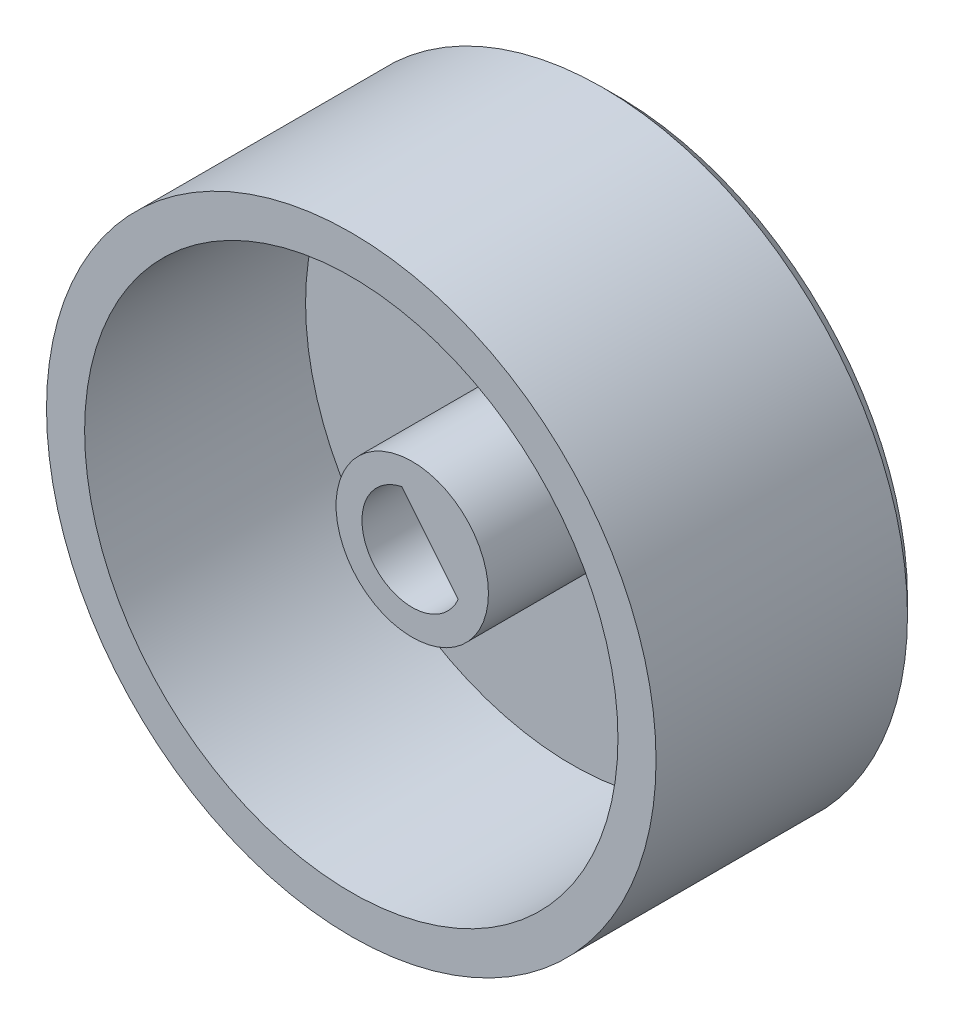
ISO-10303-21;
HEADER;
FILE_DESCRIPTION(('STEP AP214'),'2;1');
FILE_NAME('part.step','',(''),(''),'','','');
FILE_SCHEMA(('AUTOMOTIVE_DESIGN { 1 0 10303 214 1 1 1 1 }'));
ENDSEC;
DATA;
#1=APPLICATION_CONTEXT('core data for automotive mechanical design processes');
#2=APPLICATION_PROTOCOL_DEFINITION('international standard','automotive_design',2000,#1);
#3=PRODUCT_CONTEXT('',#1,'mechanical');
#4=PRODUCT('Part','Part','',(#3));
#5=PRODUCT_RELATED_PRODUCT_CATEGORY('part','',(#4));
#6=PRODUCT_DEFINITION_FORMATION('','',#4);
#7=PRODUCT_DEFINITION_CONTEXT('part definition',#1,'design');
#8=PRODUCT_DEFINITION('design','',#6,#7);
#9=PRODUCT_DEFINITION_SHAPE('','',#8);
#10=(LENGTH_UNIT() NAMED_UNIT(*) SI_UNIT(.MILLI.,.METRE.));
#11=(NAMED_UNIT(*) PLANE_ANGLE_UNIT() SI_UNIT($,.RADIAN.));
#12=(NAMED_UNIT(*) SI_UNIT($,.STERADIAN.) SOLID_ANGLE_UNIT());
#13=UNCERTAINTY_MEASURE_WITH_UNIT(LENGTH_MEASURE(1.E-05),#10,'distance_accuracy_value','');
#14=(GEOMETRIC_REPRESENTATION_CONTEXT(3) GLOBAL_UNCERTAINTY_ASSIGNED_CONTEXT((#13)) GLOBAL_UNIT_ASSIGNED_CONTEXT((#10,
#11,#12)) REPRESENTATION_CONTEXT('',''));
#15=CARTESIAN_POINT('',(0.,0.,0.));
#16=DIRECTION('',(0.,0.,1.));
#17=DIRECTION('',(1.,0.,0.));
#18=AXIS2_PLACEMENT_3D('',#15,#16,#17);
#19=CARTESIAN_POINT('',(0.,0.,3.));
#20=DIRECTION('',(0.,0.,1.));
#21=DIRECTION('',(1.,0.,0.));
#22=AXIS2_PLACEMENT_3D('',#19,#20,#21);
#23=CYLINDRICAL_SURFACE('',#22,5.);
#24=CARTESIAN_POINT('',(0.,0.,3.));
#25=DIRECTION('',(0.,0.,1.));
#26=DIRECTION('',(1.,0.,0.));
#27=AXIS2_PLACEMENT_3D('',#24,#25,#26);
#28=CIRCLE('',#27,5.);
#29=CARTESIAN_POINT('',(5.,0.,3.));
#30=VERTEX_POINT('',#29);
#31=EDGE_CURVE('E91',#30,#30,#28,.T.);
#32=ORIENTED_EDGE('',*,*,#31,.T.);
#33=EDGE_LOOP('',(#32));
#34=FACE_BOUND('',#33,.T.);
#35=CARTESIAN_POINT('',(0.,0.,13.5));
#36=DIRECTION('',(0.,0.,1.));
#37=DIRECTION('',(1.,0.,0.));
#38=AXIS2_PLACEMENT_3D('',#35,#36,#37);
#39=CIRCLE('',#38,5.);
#40=CARTESIAN_POINT('',(5.,0.,13.5));
#41=VERTEX_POINT('',#40);
#42=EDGE_CURVE('E82',#41,#41,#39,.T.);
#43=ORIENTED_EDGE('',*,*,#42,.F.);
#44=EDGE_LOOP('',(#43));
#45=FACE_BOUND('',#44,.T.);
#46=ADVANCED_FACE('F41',(#34,#45),#23,.T.);
#47=CARTESIAN_POINT('',(0.,0.,3.));
#48=DIRECTION('',(0.,0.,1.));
#49=DIRECTION('',(1.,0.,0.));
#50=AXIS2_PLACEMENT_3D('',#47,#48,#49);
#51=CYLINDRICAL_SURFACE('',#50,17.5);
#52=CARTESIAN_POINT('',(0.,0.,3.));
#53=DIRECTION('',(0.,0.,1.));
#54=DIRECTION('',(1.,0.,0.));
#55=AXIS2_PLACEMENT_3D('',#52,#53,#54);
#56=CIRCLE('',#55,17.5);
#57=CARTESIAN_POINT('',(17.5,0.,3.));
#58=VERTEX_POINT('',#57);
#59=EDGE_CURVE('E74',#58,#58,#56,.T.);
#60=ORIENTED_EDGE('',*,*,#59,.F.);
#61=EDGE_LOOP('',(#60));
#62=FACE_BOUND('',#61,.T.);
#63=CARTESIAN_POINT('',(0.,0.,17.5));
#64=DIRECTION('',(0.,0.,1.));
#65=DIRECTION('',(1.,0.,0.));
#66=AXIS2_PLACEMENT_3D('',#63,#64,#65);
#67=CIRCLE('',#66,17.5);
#68=CARTESIAN_POINT('',(17.5,0.,17.5));
#69=VERTEX_POINT('',#68);
#70=EDGE_CURVE('E146',#69,#69,#67,.T.);
#71=ORIENTED_EDGE('',*,*,#70,.T.);
#72=EDGE_LOOP('',(#71));
#73=FACE_BOUND('',#72,.T.);
#74=ADVANCED_FACE('F119',(#62,#73),#51,.F.);
#75=CARTESIAN_POINT('',(0.,0.,3.));
#76=DIRECTION('',(0.,0.,1.));
#77=DIRECTION('',(1.,0.,0.));
#78=AXIS2_PLACEMENT_3D('',#75,#76,#77);
#79=PLANE('',#78);
#80=ORIENTED_EDGE('',*,*,#31,.F.);
#81=EDGE_LOOP('',(#80));
#82=FACE_BOUND('',#81,.T.);
#83=ORIENTED_EDGE('',*,*,#59,.T.);
#84=EDGE_LOOP('',(#83));
#85=FACE_BOUND('',#84,.T.);
#86=ADVANCED_FACE('F125',(#82,#85),#79,.T.);
#87=CARTESIAN_POINT('',(0.,0.,13.5));
#88=DIRECTION('',(0.,0.,1.));
#89=DIRECTION('',(1.,0.,0.));
#90=AXIS2_PLACEMENT_3D('',#87,#88,#89);
#91=PLANE('',#90);
#92=ORIENTED_EDGE('',*,*,#42,.T.);
#93=EDGE_LOOP('',(#92));
#94=FACE_BOUND('',#93,.T.);
#95=CARTESIAN_POINT('',(0.,0.,13.5));
#96=DIRECTION('',(0.,0.,1.));
#97=DIRECTION('',(1.,0.,0.));
#98=AXIS2_PLACEMENT_3D('',#95,#96,#97);
#99=CIRCLE('',#98,3.3);
#100=CARTESIAN_POINT('',(3.01491634230997,-1.34174492690388,13.5));
#101=VERTEX_POINT('',#100);
#102=CARTESIAN_POINT('',(-0.682606965857115,3.22862938879075,13.5));
#103=VERTEX_POINT('',#102);
#104=EDGE_CURVE('E57',#101,#103,#99,.F.);
#105=ORIENTED_EDGE('',*,*,#104,.T.);
#106=DIRECTION('',(0.628961487295624,-0.777436458817617,0.));
#107=VECTOR('',#106,1.);
#108=CARTESIAN_POINT('',(-0.682606965857115,3.22862938879075,13.5));
#109=LINE('',#108,#107);
#110=EDGE_CURVE('E70',#103,#101,#109,.T.);
#111=ORIENTED_EDGE('',*,*,#110,.T.);
#112=EDGE_LOOP('',(#105,#111));
#113=FACE_BOUND('',#112,.T.);
#114=ADVANCED_FACE('F71',(#94,#113),#91,.T.);
#115=CARTESIAN_POINT('',(0.,0.,4.5));
#116=DIRECTION('',(0.,0.,1.));
#117=DIRECTION('',(1.,0.,0.));
#118=AXIS2_PLACEMENT_3D('',#115,#116,#117);
#119=PLANE('',#118);
#120=CARTESIAN_POINT('',(0.,0.,4.5));
#121=DIRECTION('',(0.,0.,1.));
#122=DIRECTION('',(1.,0.,0.));
#123=AXIS2_PLACEMENT_3D('',#120,#121,#122);
#124=CIRCLE('',#123,3.3);
#125=CARTESIAN_POINT('',(-0.682606965857115,3.22862938879075,4.5));
#126=VERTEX_POINT('',#125);
#127=CARTESIAN_POINT('',(3.01491634230997,-1.34174492690388,4.5));
#128=VERTEX_POINT('',#127);
#129=EDGE_CURVE('E81',#126,#128,#124,.T.);
#130=ORIENTED_EDGE('',*,*,#129,.T.);
#131=DIRECTION('',(-0.628961487295624,0.777436458817617,0.));
#132=VECTOR('',#131,1.);
#133=CARTESIAN_POINT('',(-0.682606965857115,3.22862938879075,4.5));
#134=LINE('',#133,#132);
#135=EDGE_CURVE('E86',#128,#126,#134,.T.);
#136=ORIENTED_EDGE('',*,*,#135,.T.);
#137=EDGE_LOOP('',(#130,#136));
#138=FACE_BOUND('',#137,.T.);
#139=ADVANCED_FACE('F137',(#138),#119,.T.);
#140=CARTESIAN_POINT('',(-0.682606965857115,3.22862938879075,4.5));
#141=DIRECTION('',(0.777436458817617,0.628961487295624,0.));
#142=DIRECTION('',(-0.628961487295624,0.777436458817617,0.));
#143=AXIS2_PLACEMENT_3D('',#140,#141,#142);
#144=PLANE('',#143);
#145=ORIENTED_EDGE('',*,*,#110,.F.);
#146=DIRECTION('',(0.,0.,1.));
#147=VECTOR('',#146,1.);
#148=CARTESIAN_POINT('',(-0.682606965857115,3.22862938879075,4.5));
#149=LINE('',#148,#147);
#150=EDGE_CURVE('E64',#126,#103,#149,.T.);
#151=ORIENTED_EDGE('',*,*,#150,.F.);
#152=ORIENTED_EDGE('',*,*,#135,.F.);
#153=DIRECTION('',(0.,0.,1.));
#154=VECTOR('',#153,1.);
#155=CARTESIAN_POINT('',(3.01491634230997,-1.34174492690388,4.5));
#156=LINE('',#155,#154);
#157=EDGE_CURVE('E78',#128,#101,#156,.T.);
#158=ORIENTED_EDGE('',*,*,#157,.T.);
#159=EDGE_LOOP('',(#145,#151,#152,#158));
#160=FACE_BOUND('',#159,.T.);
#161=ADVANCED_FACE('F84',(#160),#144,.F.);
#162=CARTESIAN_POINT('',(0.,0.,4.5));
#163=DIRECTION('',(0.,0.,1.));
#164=DIRECTION('',(1.,0.,0.));
#165=AXIS2_PLACEMENT_3D('',#162,#163,#164);
#166=CYLINDRICAL_SURFACE('',#165,3.3);
#167=ORIENTED_EDGE('',*,*,#104,.F.);
#168=ORIENTED_EDGE('',*,*,#157,.F.);
#169=ORIENTED_EDGE('',*,*,#129,.F.);
#170=ORIENTED_EDGE('',*,*,#150,.T.);
#171=EDGE_LOOP('',(#167,#168,#169,#170));
#172=FACE_BOUND('',#171,.T.);
#173=ADVANCED_FACE('F77',(#172),#166,.F.);
#174=CARTESIAN_POINT('',(0.,0.,17.5));
#175=DIRECTION('',(0.,0.,1.));
#176=DIRECTION('',(1.,0.,0.));
#177=AXIS2_PLACEMENT_3D('',#174,#175,#176);
#178=PLANE('',#177);
#179=CARTESIAN_POINT('',(0.,0.,17.5));
#180=DIRECTION('',(0.,0.,1.));
#181=DIRECTION('',(1.,0.,0.));
#182=AXIS2_PLACEMENT_3D('',#179,#180,#181);
#183=CIRCLE('',#182,20.);
#184=CARTESIAN_POINT('',(20.,0.,17.5));
#185=VERTEX_POINT('',#184);
#186=EDGE_CURVE('E149',#185,#185,#183,.T.);
#187=ORIENTED_EDGE('',*,*,#186,.T.);
#188=EDGE_LOOP('',(#187));
#189=FACE_BOUND('',#188,.T.);
#190=ORIENTED_EDGE('',*,*,#70,.F.);
#191=EDGE_LOOP('',(#190));
#192=FACE_BOUND('',#191,.T.);
#193=ADVANCED_FACE('F114',(#189,#192),#178,.T.);
#194=CARTESIAN_POINT('',(0.,0.,0.));
#195=DIRECTION('',(0.,0.,1.));
#196=DIRECTION('',(1.,0.,0.));
#197=AXIS2_PLACEMENT_3D('',#194,#195,#196);
#198=PLANE('',#197);
#199=CARTESIAN_POINT('',(0.,0.,0.));
#200=DIRECTION('',(0.,0.,1.));
#201=DIRECTION('',(1.,0.,0.));
#202=AXIS2_PLACEMENT_3D('',#199,#200,#201);
#203=CIRCLE('',#202,19.);
#204=CARTESIAN_POINT('',(19.,0.,0.));
#205=VERTEX_POINT('',#204);
#206=EDGE_CURVE('E11',#205,#205,#203,.F.);
#207=ORIENTED_EDGE('',*,*,#206,.T.);
#208=EDGE_LOOP('',(#207));
#209=FACE_BOUND('',#208,.T.);
#210=ADVANCED_FACE('F108',(#209),#198,.F.);
#211=CARTESIAN_POINT('',(0.,0.,1.));
#212=DIRECTION('',(0.,0.,1.));
#213=DIRECTION('',(1.,0.,0.));
#214=AXIS2_PLACEMENT_3D('',#211,#212,#213);
#215=CONICAL_SURFACE('',#214,20.,0.785398163397452);
#216=ORIENTED_EDGE('',*,*,#206,.F.);
#217=EDGE_LOOP('',(#216));
#218=FACE_BOUND('',#217,.T.);
#219=CARTESIAN_POINT('',(0.,0.,1.));
#220=DIRECTION('',(0.,0.,1.));
#221=DIRECTION('',(1.,0.,0.));
#222=AXIS2_PLACEMENT_3D('',#219,#220,#221);
#223=CIRCLE('',#222,20.);
#224=CARTESIAN_POINT('',(20.,0.,1.));
#225=VERTEX_POINT('',#224);
#226=EDGE_CURVE('E51',#225,#225,#223,.T.);
#227=ORIENTED_EDGE('',*,*,#226,.F.);
#228=EDGE_LOOP('',(#227));
#229=FACE_BOUND('',#228,.T.);
#230=ADVANCED_FACE('F44',(#218,#229),#215,.T.);
#231=CARTESIAN_POINT('',(0.,0.,15.));
#232=DIRECTION('',(0.,0.,-1.));
#233=DIRECTION('',(-1.,0.,0.));
#234=AXIS2_PLACEMENT_3D('',#231,#232,#233);
#235=CYLINDRICAL_SURFACE('',#234,20.);
#236=ORIENTED_EDGE('',*,*,#226,.T.);
#237=EDGE_LOOP('',(#236));
#238=FACE_BOUND('',#237,.T.);
#239=ORIENTED_EDGE('',*,*,#186,.F.);
#240=EDGE_LOOP('',(#239));
#241=FACE_BOUND('',#240,.T.);
#242=ADVANCED_FACE('F104',(#238,#241),#235,.T.);
#243=CLOSED_SHELL('',(#46,#74,#86,#114,#139,#161,#173,#193,#210,#230,#242));
#244=MANIFOLD_SOLID_BREP('B2',#243);
#245=ADVANCED_BREP_SHAPE_REPRESENTATION('',(#18,#244),#14);
#246=SHAPE_DEFINITION_REPRESENTATION(#9,#245);
ENDSEC;
END-ISO-10303-21;
